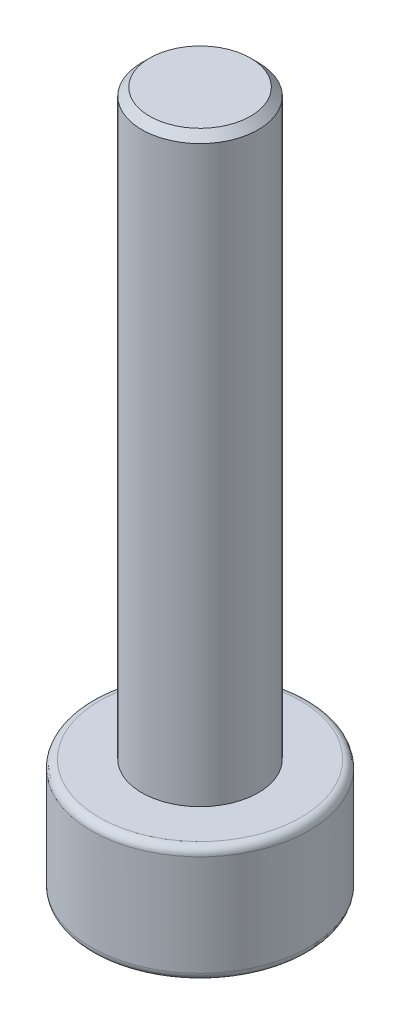
ISO-10303-21;
HEADER;
FILE_DESCRIPTION(('STEP AP214'),'2;1');
FILE_NAME('part.step','',(''),(''),'','','');
FILE_SCHEMA(('AUTOMOTIVE_DESIGN { 1 0 10303 214 1 1 1 1 }'));
ENDSEC;
DATA;
#1=APPLICATION_CONTEXT('core data for automotive mechanical design processes');
#2=APPLICATION_PROTOCOL_DEFINITION('international standard','automotive_design',2000,#1);
#3=PRODUCT_CONTEXT('',#1,'mechanical');
#4=PRODUCT('Part','Part','',(#3));
#5=PRODUCT_RELATED_PRODUCT_CATEGORY('part','',(#4));
#6=PRODUCT_DEFINITION_FORMATION('','',#4);
#7=PRODUCT_DEFINITION_CONTEXT('part definition',#1,'design');
#8=PRODUCT_DEFINITION('design','',#6,#7);
#9=PRODUCT_DEFINITION_SHAPE('','',#8);
#10=(LENGTH_UNIT() NAMED_UNIT(*) SI_UNIT(.MILLI.,.METRE.));
#11=(NAMED_UNIT(*) PLANE_ANGLE_UNIT() SI_UNIT($,.RADIAN.));
#12=(NAMED_UNIT(*) SI_UNIT($,.STERADIAN.) SOLID_ANGLE_UNIT());
#13=UNCERTAINTY_MEASURE_WITH_UNIT(LENGTH_MEASURE(1.E-05),#10,'distance_accuracy_value','');
#14=(GEOMETRIC_REPRESENTATION_CONTEXT(3) GLOBAL_UNCERTAINTY_ASSIGNED_CONTEXT((#13)) GLOBAL_UNIT_ASSIGNED_CONTEXT((#10,
#11,#12)) REPRESENTATION_CONTEXT('',''));
#15=CARTESIAN_POINT('',(0.,0.,0.));
#16=DIRECTION('',(0.,0.,1.));
#17=DIRECTION('',(1.,0.,0.));
#18=AXIS2_PLACEMENT_3D('',#15,#16,#17);
#19=CARTESIAN_POINT('',(-1.25,2.5,-0.721687836487033));
#20=DIRECTION('',(-0.5,0.,-0.866025403784439));
#21=DIRECTION('',(-0.866025403784439,0.,0.5));
#22=AXIS2_PLACEMENT_3D('',#19,#20,#21);
#23=PLANE('',#22);
#24=DIRECTION('',(0.,1.,0.));
#25=VECTOR('',#24,1.);
#26=CARTESIAN_POINT('',(0.,2.5,-1.44337567297407));
#27=LINE('',#26,#25);
#28=CARTESIAN_POINT('',(0.,0.,-1.44337567297407));
#29=VERTEX_POINT('',#28);
#30=CARTESIAN_POINT('',(0.,2.5,-1.44337567297407));
#31=VERTEX_POINT('',#30);
#32=EDGE_CURVE('E97',#29,#31,#27,.T.);
#33=ORIENTED_EDGE('',*,*,#32,.T.);
#34=DIRECTION('',(-0.866025403784439,0.,0.5));
#35=VECTOR('',#34,1.);
#36=CARTESIAN_POINT('',(-1.25,2.5,-0.721687836487033));
#37=LINE('',#36,#35);
#38=CARTESIAN_POINT('',(-1.25,2.5,-0.721687836487033));
#39=VERTEX_POINT('',#38);
#40=EDGE_CURVE('E86',#39,#31,#37,.F.);
#41=ORIENTED_EDGE('',*,*,#40,.F.);
#42=DIRECTION('',(0.,1.,0.));
#43=VECTOR('',#42,1.);
#44=CARTESIAN_POINT('',(-1.25,2.5,-0.721687836487033));
#45=LINE('',#44,#43);
#46=CARTESIAN_POINT('',(-1.25,0.,-0.721687836487033));
#47=VERTEX_POINT('',#46);
#48=EDGE_CURVE('E106',#39,#47,#45,.F.);
#49=ORIENTED_EDGE('',*,*,#48,.T.);
#50=DIRECTION('',(-0.866025403784439,0.,0.5));
#51=VECTOR('',#50,1.);
#52=CARTESIAN_POINT('',(-1.25,0.,-0.721687836487033));
#53=LINE('',#52,#51);
#54=EDGE_CURVE('E81',#29,#47,#53,.T.);
#55=ORIENTED_EDGE('',*,*,#54,.F.);
#56=EDGE_LOOP('',(#33,#41,#49,#55));
#57=FACE_BOUND('',#56,.T.);
#58=ADVANCED_FACE('F17',(#57),#23,.F.);
#59=CARTESIAN_POINT('',(0.,2.5,-1.44337567297407));
#60=DIRECTION('',(0.5,0.,-0.866025403784439));
#61=DIRECTION('',(-0.866025403784439,0.,-0.5));
#62=AXIS2_PLACEMENT_3D('',#59,#60,#61);
#63=PLANE('',#62);
#64=DIRECTION('',(0.,1.,0.));
#65=VECTOR('',#64,1.);
#66=CARTESIAN_POINT('',(1.25,2.5,-0.721687836487033));
#67=LINE('',#66,#65);
#68=CARTESIAN_POINT('',(1.25,0.,-0.721687836487033));
#69=VERTEX_POINT('',#68);
#70=CARTESIAN_POINT('',(1.25,2.5,-0.721687836487033));
#71=VERTEX_POINT('',#70);
#72=EDGE_CURVE('E102',#69,#71,#67,.T.);
#73=ORIENTED_EDGE('',*,*,#72,.T.);
#74=DIRECTION('',(-0.866025403784439,0.,-0.5));
#75=VECTOR('',#74,1.);
#76=CARTESIAN_POINT('',(0.,2.5,-1.44337567297407));
#77=LINE('',#76,#75);
#78=EDGE_CURVE('E90',#31,#71,#77,.F.);
#79=ORIENTED_EDGE('',*,*,#78,.F.);
#80=ORIENTED_EDGE('',*,*,#32,.F.);
#81=DIRECTION('',(-0.866025403784439,0.,-0.5));
#82=VECTOR('',#81,1.);
#83=CARTESIAN_POINT('',(0.,0.,-1.44337567297407));
#84=LINE('',#83,#82);
#85=EDGE_CURVE('E104',#69,#29,#84,.T.);
#86=ORIENTED_EDGE('',*,*,#85,.F.);
#87=EDGE_LOOP('',(#73,#79,#80,#86));
#88=FACE_BOUND('',#87,.T.);
#89=ADVANCED_FACE('F100',(#88),#63,.F.);
#90=CARTESIAN_POINT('',(-1.25,2.5,0.721687836487032));
#91=DIRECTION('',(-1.,0.,0.));
#92=DIRECTION('',(0.,0.,1.));
#93=AXIS2_PLACEMENT_3D('',#90,#91,#92);
#94=PLANE('',#93);
#95=ORIENTED_EDGE('',*,*,#48,.F.);
#96=DIRECTION('',(0.,0.,-1.));
#97=VECTOR('',#96,1.);
#98=CARTESIAN_POINT('',(-1.25,2.5,0.));
#99=LINE('',#98,#97);
#100=CARTESIAN_POINT('',(-1.25,2.5,0.721687836487031));
#101=VERTEX_POINT('',#100);
#102=EDGE_CURVE('E93',#101,#39,#99,.T.);
#103=ORIENTED_EDGE('',*,*,#102,.F.);
#104=DIRECTION('',(0.,1.,0.));
#105=VECTOR('',#104,1.);
#106=CARTESIAN_POINT('',(-1.25,2.5,0.721687836487031));
#107=LINE('',#106,#105);
#108=CARTESIAN_POINT('',(-1.25,0.,0.721687836487031));
#109=VERTEX_POINT('',#108);
#110=EDGE_CURVE('E187',#101,#109,#107,.F.);
#111=ORIENTED_EDGE('',*,*,#110,.T.);
#112=DIRECTION('',(0.,0.,1.));
#113=VECTOR('',#112,1.);
#114=CARTESIAN_POINT('',(-1.25,0.,0.721687836487032));
#115=LINE('',#114,#113);
#116=EDGE_CURVE('E199',#47,#109,#115,.T.);
#117=ORIENTED_EDGE('',*,*,#116,.F.);
#118=EDGE_LOOP('',(#95,#103,#111,#117));
#119=FACE_BOUND('',#118,.T.);
#120=ADVANCED_FACE('F202',(#119),#94,.F.);
#121=CARTESIAN_POINT('',(1.25,2.5,-0.721687836487033));
#122=DIRECTION('',(1.,0.,0.));
#123=DIRECTION('',(0.,0.,-1.));
#124=AXIS2_PLACEMENT_3D('',#121,#122,#123);
#125=PLANE('',#124);
#126=DIRECTION('',(0.,1.,0.));
#127=VECTOR('',#126,1.);
#128=CARTESIAN_POINT('',(1.25,2.5,0.721687836487032));
#129=LINE('',#128,#127);
#130=CARTESIAN_POINT('',(1.25,0.,0.721687836487032));
#131=VERTEX_POINT('',#130);
#132=CARTESIAN_POINT('',(1.25,2.5,0.721687836487032));
#133=VERTEX_POINT('',#132);
#134=EDGE_CURVE('E183',#131,#133,#129,.T.);
#135=ORIENTED_EDGE('',*,*,#134,.T.);
#136=DIRECTION('',(0.,0.,-1.));
#137=VECTOR('',#136,1.);
#138=CARTESIAN_POINT('',(1.25,2.5,0.));
#139=LINE('',#138,#137);
#140=EDGE_CURVE('E193',#71,#133,#139,.F.);
#141=ORIENTED_EDGE('',*,*,#140,.F.);
#142=ORIENTED_EDGE('',*,*,#72,.F.);
#143=DIRECTION('',(0.,0.,-1.));
#144=VECTOR('',#143,1.);
#145=CARTESIAN_POINT('',(1.25,0.,-0.721687836487033));
#146=LINE('',#145,#144);
#147=EDGE_CURVE('E195',#131,#69,#146,.T.);
#148=ORIENTED_EDGE('',*,*,#147,.F.);
#149=EDGE_LOOP('',(#135,#141,#142,#148));
#150=FACE_BOUND('',#149,.T.);
#151=ADVANCED_FACE('F211',(#150),#125,.F.);
#152=CARTESIAN_POINT('',(0.,2.5,0.));
#153=DIRECTION('',(0.,-1.,0.));
#154=DIRECTION('',(0.,0.,-1.));
#155=AXIS2_PLACEMENT_3D('',#152,#153,#154);
#156=PLANE('',#155);
#157=ORIENTED_EDGE('',*,*,#40,.T.);
#158=ORIENTED_EDGE('',*,*,#78,.T.);
#159=ORIENTED_EDGE('',*,*,#140,.T.);
#160=DIRECTION('',(0.866025403784439,0.,-0.5));
#161=VECTOR('',#160,1.);
#162=CARTESIAN_POINT('',(1.25,2.5,0.721687836487032));
#163=LINE('',#162,#161);
#164=CARTESIAN_POINT('',(0.,2.5,1.44337567297406));
#165=VERTEX_POINT('',#164);
#166=EDGE_CURVE('E181',#133,#165,#163,.F.);
#167=ORIENTED_EDGE('',*,*,#166,.T.);
#168=DIRECTION('',(0.866025403784438,0.,0.5));
#169=VECTOR('',#168,1.);
#170=CARTESIAN_POINT('',(0.,2.5,1.44337567297406));
#171=LINE('',#170,#169);
#172=EDGE_CURVE('E190',#165,#101,#171,.F.);
#173=ORIENTED_EDGE('',*,*,#172,.T.);
#174=ORIENTED_EDGE('',*,*,#102,.T.);
#175=EDGE_LOOP('',(#157,#158,#159,#167,#173,#174));
#176=FACE_BOUND('',#175,.T.);
#177=ADVANCED_FACE('F87',(#176),#156,.T.);
#178=CARTESIAN_POINT('',(0.,2.5,1.44337567297406));
#179=DIRECTION('',(-0.5,0.,0.866025403784438));
#180=DIRECTION('',(0.866025403784438,0.,0.5));
#181=AXIS2_PLACEMENT_3D('',#178,#179,#180);
#182=PLANE('',#181);
#183=ORIENTED_EDGE('',*,*,#110,.F.);
#184=ORIENTED_EDGE('',*,*,#172,.F.);
#185=DIRECTION('',(0.,1.,0.));
#186=VECTOR('',#185,1.);
#187=CARTESIAN_POINT('',(0.,2.5,1.44337567297406));
#188=LINE('',#187,#186);
#189=CARTESIAN_POINT('',(0.,0.,1.44337567297406));
#190=VERTEX_POINT('',#189);
#191=EDGE_CURVE('E172',#165,#190,#188,.F.);
#192=ORIENTED_EDGE('',*,*,#191,.T.);
#193=DIRECTION('',(0.866025403784438,0.,0.5));
#194=VECTOR('',#193,1.);
#195=CARTESIAN_POINT('',(0.,0.,1.44337567297406));
#196=LINE('',#195,#194);
#197=EDGE_CURVE('E185',#109,#190,#196,.T.);
#198=ORIENTED_EDGE('',*,*,#197,.F.);
#199=EDGE_LOOP('',(#183,#184,#192,#198));
#200=FACE_BOUND('',#199,.T.);
#201=ADVANCED_FACE('F218',(#200),#182,.F.);
#202=CARTESIAN_POINT('',(1.25,2.5,0.721687836487032));
#203=DIRECTION('',(0.5,0.,0.866025403784439));
#204=DIRECTION('',(0.866025403784439,0.,-0.5));
#205=AXIS2_PLACEMENT_3D('',#202,#203,#204);
#206=PLANE('',#205);
#207=ORIENTED_EDGE('',*,*,#191,.F.);
#208=ORIENTED_EDGE('',*,*,#166,.F.);
#209=ORIENTED_EDGE('',*,*,#134,.F.);
#210=DIRECTION('',(-0.866025403784439,0.,0.5));
#211=VECTOR('',#210,1.);
#212=CARTESIAN_POINT('',(1.25,0.,0.721687836487032));
#213=LINE('',#212,#211);
#214=EDGE_CURVE('E180',#131,#190,#213,.T.);
#215=ORIENTED_EDGE('',*,*,#214,.T.);
#216=EDGE_LOOP('',(#207,#208,#209,#215));
#217=FACE_BOUND('',#216,.T.);
#218=ADVANCED_FACE('F216',(#217),#206,.F.);
#219=CARTESIAN_POINT('',(0.,0.,0.));
#220=DIRECTION('',(0.,1.,0.));
#221=DIRECTION('',(0.,0.,1.));
#222=AXIS2_PLACEMENT_3D('',#219,#220,#221);
#223=PLANE('',#222);
#224=ORIENTED_EDGE('',*,*,#147,.T.);
#225=ORIENTED_EDGE('',*,*,#85,.T.);
#226=ORIENTED_EDGE('',*,*,#54,.T.);
#227=ORIENTED_EDGE('',*,*,#116,.T.);
#228=ORIENTED_EDGE('',*,*,#197,.T.);
#229=ORIENTED_EDGE('',*,*,#214,.F.);
#230=EDGE_LOOP('',(#224,#225,#226,#227,#228,#229));
#231=FACE_BOUND('',#230,.T.);
#232=CARTESIAN_POINT('',(0.,0.,0.));
#233=DIRECTION('',(0.,1.,0.));
#234=DIRECTION('',(0.,0.,1.));
#235=AXIS2_PLACEMENT_3D('',#232,#233,#234);
#236=CIRCLE('',#235,2.6);
#237=CARTESIAN_POINT('',(0.,0.,2.6));
#238=VERTEX_POINT('',#237);
#239=CARTESIAN_POINT('',(0.,0.,-2.6));
#240=VERTEX_POINT('',#239);
#241=EDGE_CURVE('E272',#238,#240,#236,.T.);
#242=ORIENTED_EDGE('',*,*,#241,.F.);
#243=CARTESIAN_POINT('',(0.,0.,0.));
#244=DIRECTION('',(0.,1.,0.));
#245=DIRECTION('',(0.,0.,-1.));
#246=AXIS2_PLACEMENT_3D('',#243,#244,#245);
#247=CIRCLE('',#246,2.6);
#248=EDGE_CURVE('E271',#240,#238,#247,.T.);
#249=ORIENTED_EDGE('',*,*,#248,.F.);
#250=EDGE_LOOP('',(#242,#249));
#251=FACE_BOUND('',#250,.T.);
#252=ADVANCED_FACE('F160',(#231,#251),#223,.F.);
#253=CARTESIAN_POINT('',(0.,0.2,0.));
#254=DIRECTION('',(0.,1.,0.));
#255=DIRECTION('',(0.,0.,1.));
#256=AXIS2_PLACEMENT_3D('',#253,#254,#255);
#257=TOROIDAL_SURFACE('',#256,2.6,0.2);
#258=ORIENTED_EDGE('',*,*,#241,.T.);
#259=ORIENTED_EDGE('',*,*,#248,.T.);
#260=EDGE_LOOP('',(#258,#259));
#261=FACE_BOUND('',#260,.T.);
#262=CARTESIAN_POINT('',(0.,0.2,0.));
#263=DIRECTION('',(0.,-1.,0.));
#264=DIRECTION('',(0.,0.,-1.));
#265=AXIS2_PLACEMENT_3D('',#262,#263,#264);
#266=CIRCLE('',#265,2.8);
#267=CARTESIAN_POINT('',(0.,0.2,-2.8));
#268=VERTEX_POINT('',#267);
#269=EDGE_CURVE('E151',#268,#268,#266,.F.);
#270=ORIENTED_EDGE('',*,*,#269,.F.);
#271=EDGE_LOOP('',(#270));
#272=FACE_BOUND('',#271,.T.);
#273=ADVANCED_FACE('F155',(#261,#272),#257,.T.);
#274=CARTESIAN_POINT('',(0.,3.,0.));
#275=DIRECTION('',(0.,-1.,0.));
#276=DIRECTION('',(0.,0.,-1.));
#277=AXIS2_PLACEMENT_3D('',#274,#275,#276);
#278=CYLINDRICAL_SURFACE('',#277,2.8);
#279=CARTESIAN_POINT('',(0.,2.8,0.));
#280=DIRECTION('',(0.,1.,0.));
#281=DIRECTION('',(0.,0.,1.));
#282=AXIS2_PLACEMENT_3D('',#279,#280,#281);
#283=CIRCLE('',#282,2.8);
#284=CARTESIAN_POINT('',(0.,2.8,2.8));
#285=VERTEX_POINT('',#284);
#286=EDGE_CURVE('E115',#285,#285,#283,.T.);
#287=ORIENTED_EDGE('',*,*,#286,.F.);
#288=EDGE_LOOP('',(#287));
#289=FACE_BOUND('',#288,.T.);
#290=ORIENTED_EDGE('',*,*,#269,.T.);
#291=EDGE_LOOP('',(#290));
#292=FACE_BOUND('',#291,.T.);
#293=ADVANCED_FACE('F159',(#289,#292),#278,.T.);
#294=CARTESIAN_POINT('',(0.,18.,0.));
#295=DIRECTION('',(0.,1.,0.));
#296=DIRECTION('',(0.,0.,1.));
#297=AXIS2_PLACEMENT_3D('',#294,#295,#296);
#298=PLANE('',#297);
#299=CARTESIAN_POINT('',(0.,18.0000000000291,0.));
#300=DIRECTION('',(0.,-1.,0.));
#301=DIRECTION('',(0.,0.,-1.));
#302=AXIS2_PLACEMENT_3D('',#299,#300,#301);
#303=CIRCLE('',#302,1.29999999995789);
#304=CARTESIAN_POINT('',(0.,18.0000000000291,-1.29999999995789));
#305=VERTEX_POINT('',#304);
#306=EDGE_CURVE('E111',#305,#305,#303,.T.);
#307=ORIENTED_EDGE('',*,*,#306,.F.);
#308=EDGE_LOOP('',(#307));
#309=FACE_BOUND('',#308,.T.);
#310=ADVANCED_FACE('F132',(#309),#298,.T.);
#311=CARTESIAN_POINT('',(0.,2.8,0.));
#312=DIRECTION('',(0.,1.,0.));
#313=DIRECTION('',(0.,0.,1.));
#314=AXIS2_PLACEMENT_3D('',#311,#312,#313);
#315=TOROIDAL_SURFACE('',#314,2.6,0.2);
#316=ORIENTED_EDGE('',*,*,#286,.T.);
#317=EDGE_LOOP('',(#316));
#318=FACE_BOUND('',#317,.T.);
#319=CARTESIAN_POINT('',(0.,3.,0.));
#320=DIRECTION('',(0.,-1.,0.));
#321=DIRECTION('',(0.,0.,1.));
#322=AXIS2_PLACEMENT_3D('',#319,#320,#321);
#323=CIRCLE('',#322,2.6);
#324=CARTESIAN_POINT('',(0.,3.,-2.6));
#325=VERTEX_POINT('',#324);
#326=CARTESIAN_POINT('',(0.,3.,2.6));
#327=VERTEX_POINT('',#326);
#328=EDGE_CURVE('E36',#325,#327,#323,.F.);
#329=ORIENTED_EDGE('',*,*,#328,.F.);
#330=CARTESIAN_POINT('',(0.,3.,0.));
#331=DIRECTION('',(0.,-1.,0.));
#332=DIRECTION('',(0.,0.,-1.));
#333=AXIS2_PLACEMENT_3D('',#330,#331,#332);
#334=CIRCLE('',#333,2.6);
#335=EDGE_CURVE('E114',#327,#325,#334,.F.);
#336=ORIENTED_EDGE('',*,*,#335,.F.);
#337=EDGE_LOOP('',(#329,#336));
#338=FACE_BOUND('',#337,.T.);
#339=ADVANCED_FACE('F120',(#318,#338),#315,.T.);
#340=CARTESIAN_POINT('',(0.,17.8000000000225,0.));
#341=DIRECTION('',(0.,-1.,0.));
#342=DIRECTION('',(0.,0.,-1.));
#343=AXIS2_PLACEMENT_3D('',#340,#341,#342);
#344=CONICAL_SURFACE('',#343,1.50000000002137,0.785398163539557);
#345=CARTESIAN_POINT('',(0.,17.8,0.));
#346=DIRECTION('',(0.,-1.,0.));
#347=DIRECTION('',(0.,0.,-1.));
#348=AXIS2_PLACEMENT_3D('',#345,#346,#347);
#349=CIRCLE('',#348,1.5);
#350=CARTESIAN_POINT('',(0.,17.8,-1.5));
#351=VERTEX_POINT('',#350);
#352=EDGE_CURVE('E28',#351,#351,#349,.T.);
#353=ORIENTED_EDGE('',*,*,#352,.F.);
#354=EDGE_LOOP('',(#353));
#355=FACE_BOUND('',#354,.T.);
#356=ORIENTED_EDGE('',*,*,#306,.T.);
#357=EDGE_LOOP('',(#356));
#358=FACE_BOUND('',#357,.T.);
#359=ADVANCED_FACE('F131',(#355,#358),#344,.T.);
#360=CARTESIAN_POINT('',(0.,3.,0.));
#361=DIRECTION('',(0.,1.,0.));
#362=DIRECTION('',(0.,0.,1.));
#363=AXIS2_PLACEMENT_3D('',#360,#361,#362);
#364=PLANE('',#363);
#365=CARTESIAN_POINT('',(0.,3.,0.));
#366=DIRECTION('',(0.,-1.,0.));
#367=DIRECTION('',(0.,0.,-1.));
#368=AXIS2_PLACEMENT_3D('',#365,#366,#367);
#369=CIRCLE('',#368,1.5);
#370=CARTESIAN_POINT('',(0.,3.,-1.5));
#371=VERTEX_POINT('',#370);
#372=EDGE_CURVE('E11',#371,#371,#369,.F.);
#373=ORIENTED_EDGE('',*,*,#372,.F.);
#374=EDGE_LOOP('',(#373));
#375=FACE_BOUND('',#374,.T.);
#376=ORIENTED_EDGE('',*,*,#335,.T.);
#377=ORIENTED_EDGE('',*,*,#328,.T.);
#378=EDGE_LOOP('',(#376,#377));
#379=FACE_BOUND('',#378,.T.);
#380=ADVANCED_FACE('F229',(#375,#379),#364,.T.);
#381=CARTESIAN_POINT('',(0.,18.,0.));
#382=DIRECTION('',(0.,-1.,0.));
#383=DIRECTION('',(0.,0.,-1.));
#384=AXIS2_PLACEMENT_3D('',#381,#382,#383);
#385=CYLINDRICAL_SURFACE('',#384,1.5);
#386=ORIENTED_EDGE('',*,*,#372,.T.);
#387=EDGE_LOOP('',(#386));
#388=FACE_BOUND('',#387,.T.);
#389=ORIENTED_EDGE('',*,*,#352,.T.);
#390=EDGE_LOOP('',(#389));
#391=FACE_BOUND('',#390,.T.);
#392=ADVANCED_FACE('F227',(#388,#391),#385,.T.);
#393=CLOSED_SHELL('',(#58,#89,#120,#151,#177,#201,#218,#252,#273,#293,#310,#339,#359,#380,#392));
#394=MANIFOLD_SOLID_BREP('B1',#393);
#395=ADVANCED_BREP_SHAPE_REPRESENTATION('',(#18,#394),#14);
#396=SHAPE_DEFINITION_REPRESENTATION(#9,#395);
ENDSEC;
END-ISO-10303-21;
